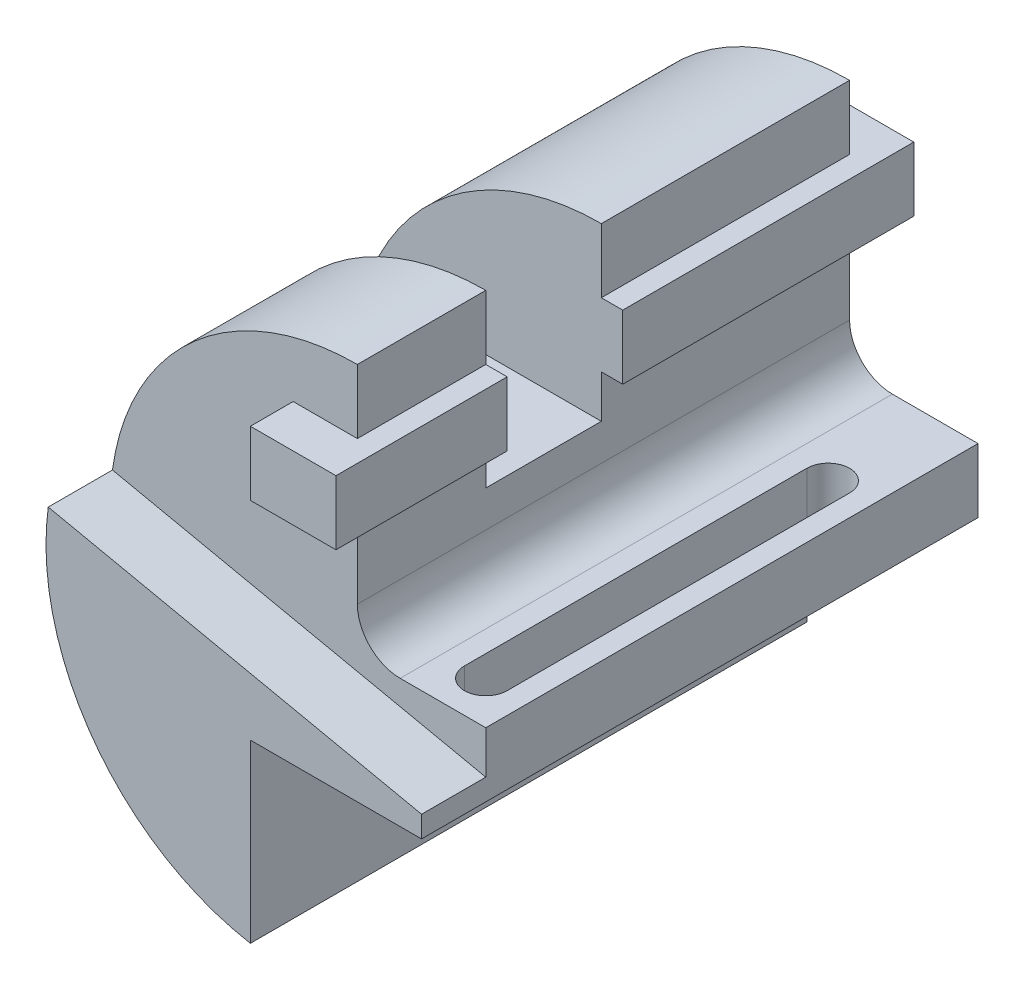
ISO-10303-21;
HEADER;
FILE_DESCRIPTION(('STEP AP214'),'2;1');
FILE_NAME('part.step','',(''),(''),'','','');
FILE_SCHEMA(('AUTOMOTIVE_DESIGN { 1 0 10303 214 1 1 1 1 }'));
ENDSEC;
DATA;
#1=APPLICATION_CONTEXT('core data for automotive mechanical design processes');
#2=APPLICATION_PROTOCOL_DEFINITION('international standard','automotive_design',2000,#1);
#3=PRODUCT_CONTEXT('',#1,'mechanical');
#4=PRODUCT('Part','Part','',(#3));
#5=PRODUCT_RELATED_PRODUCT_CATEGORY('part','',(#4));
#6=PRODUCT_DEFINITION_FORMATION('','',#4);
#7=PRODUCT_DEFINITION_CONTEXT('part definition',#1,'design');
#8=PRODUCT_DEFINITION('design','',#6,#7);
#9=PRODUCT_DEFINITION_SHAPE('','',#8);
#10=(LENGTH_UNIT() NAMED_UNIT(*) SI_UNIT(.MILLI.,.METRE.));
#11=(NAMED_UNIT(*) PLANE_ANGLE_UNIT() SI_UNIT($,.RADIAN.));
#12=(NAMED_UNIT(*) SI_UNIT($,.STERADIAN.) SOLID_ANGLE_UNIT());
#13=UNCERTAINTY_MEASURE_WITH_UNIT(LENGTH_MEASURE(1.E-05),#10,'distance_accuracy_value','');
#14=(GEOMETRIC_REPRESENTATION_CONTEXT(3) GLOBAL_UNCERTAINTY_ASSIGNED_CONTEXT((#13)) GLOBAL_UNIT_ASSIGNED_CONTEXT((#10,
#11,#12)) REPRESENTATION_CONTEXT('',''));
#15=CARTESIAN_POINT('',(0.,0.,0.));
#16=DIRECTION('',(0.,0.,1.));
#17=DIRECTION('',(1.,0.,0.));
#18=AXIS2_PLACEMENT_3D('',#15,#16,#17);
#19=CARTESIAN_POINT('',(10.,56.8776098302311,115.));
#20=DIRECTION('',(0.,0.,1.));
#21=DIRECTION('',(1.,0.,0.));
#22=AXIS2_PLACEMENT_3D('',#19,#20,#21);
#23=PLANE('',#22);
#24=CARTESIAN_POINT('',(10.,56.8776098302311,115.));
#25=DIRECTION('',(0.,0.,1.));
#26=DIRECTION('',(1.,0.,0.));
#27=AXIS2_PLACEMENT_3D('',#24,#25,#26);
#28=CIRCLE('',#27,57.75);
#29=CARTESIAN_POINT('',(10.,114.627609830231,115.));
#30=VERTEX_POINT('',#29);
#31=CARTESIAN_POINT('',(-47.222231127926,64.6672673799707,115.));
#32=VERTEX_POINT('',#31);
#33=EDGE_CURVE('E376',#30,#32,#28,.T.);
#34=ORIENTED_EDGE('',*,*,#33,.T.);
#35=DIRECTION('',(-0.978147600733806,0.207911690817756,0.));
#36=VECTOR('',#35,1.);
#37=CARTESIAN_POINT('',(40.,46.1276098302311,115.));
#38=LINE('',#37,#36);
#39=CARTESIAN_POINT('',(40.,46.1276098302311,115.));
#40=VERTEX_POINT('',#39);
#41=EDGE_CURVE('E264',#40,#32,#38,.T.);
#42=ORIENTED_EDGE('',*,*,#41,.F.);
#43=DIRECTION('',(0.,1.,0.));
#44=VECTOR('',#43,1.);
#45=CARTESIAN_POINT('',(40.,41.1276098302311,115.));
#46=LINE('',#45,#44);
#47=CARTESIAN_POINT('',(40.,56.1276098302311,115.));
#48=VERTEX_POINT('',#47);
#49=EDGE_CURVE('E378',#40,#48,#46,.T.);
#50=ORIENTED_EDGE('',*,*,#49,.T.);
#51=DIRECTION('',(-1.,0.,0.));
#52=VECTOR('',#51,1.);
#53=CARTESIAN_POINT('',(40.,56.1276098302311,115.));
#54=LINE('',#53,#52);
#55=CARTESIAN_POINT('',(20.,56.1276098302311,115.));
#56=VERTEX_POINT('',#55);
#57=EDGE_CURVE('E381',#48,#56,#54,.T.);
#58=ORIENTED_EDGE('',*,*,#57,.T.);
#59=CARTESIAN_POINT('',(20.,66.1276098302311,115.));
#60=DIRECTION('',(0.,0.,-1.));
#61=DIRECTION('',(-1.,0.,0.));
#62=AXIS2_PLACEMENT_3D('',#59,#60,#61);
#63=CIRCLE('',#62,10.);
#64=CARTESIAN_POINT('',(9.99999999999999,66.1276098302311,115.));
#65=VERTEX_POINT('',#64);
#66=EDGE_CURVE('E383',#56,#65,#63,.T.);
#67=ORIENTED_EDGE('',*,*,#66,.T.);
#68=DIRECTION('',(0.,1.,0.));
#69=VECTOR('',#68,1.);
#70=CARTESIAN_POINT('',(9.99999999999999,66.1276098302311,115.));
#71=LINE('',#70,#69);
#72=CARTESIAN_POINT('',(10.,84.6276098302311,115.));
#73=VERTEX_POINT('',#72);
#74=EDGE_CURVE('E386',#65,#73,#71,.T.);
#75=ORIENTED_EDGE('',*,*,#74,.T.);
#76=DIRECTION('',(1.,0.,0.));
#77=VECTOR('',#76,1.);
#78=CARTESIAN_POINT('',(10.,84.6276098302311,115.));
#79=LINE('',#78,#77);
#80=CARTESIAN_POINT('',(-5.00000000000003,84.6276098302311,115.));
#81=VERTEX_POINT('',#80);
#82=EDGE_CURVE('E366',#81,#73,#79,.T.);
#83=ORIENTED_EDGE('',*,*,#82,.F.);
#84=DIRECTION('',(0.,-1.,0.));
#85=VECTOR('',#84,1.);
#86=CARTESIAN_POINT('',(-5.00000000000003,56.8776098302311,115.));
#87=LINE('',#86,#85);
#88=CARTESIAN_POINT('',(-5.00000000000003,99.6276098302311,115.));
#89=VERTEX_POINT('',#88);
#90=EDGE_CURVE('E353',#89,#81,#87,.T.);
#91=ORIENTED_EDGE('',*,*,#90,.F.);
#92=DIRECTION('',(-1.,0.,0.));
#93=VECTOR('',#92,1.);
#94=CARTESIAN_POINT('',(10.,99.6276098302313,115.));
#95=LINE('',#94,#93);
#96=CARTESIAN_POINT('',(10.,99.6276098302313,115.));
#97=VERTEX_POINT('',#96);
#98=EDGE_CURVE('E373',#97,#89,#95,.T.);
#99=ORIENTED_EDGE('',*,*,#98,.F.);
#100=EDGE_CURVE('E385',#97,#30,#71,.T.);
#101=ORIENTED_EDGE('',*,*,#100,.T.);
#102=EDGE_LOOP('',(#34,#42,#50,#58,#67,#75,#83,#91,#99,#101));
#103=FACE_BOUND('',#102,.T.);
#104=ADVANCED_FACE('F43',(#103),#23,.T.);
#105=CARTESIAN_POINT('',(9.99999999999999,66.1276098302311,115.));
#106=DIRECTION('',(-1.,0.,0.));
#107=DIRECTION('',(0.,-1.,0.));
#108=AXIS2_PLACEMENT_3D('',#105,#106,#107);
#109=PLANE('',#108);
#110=DIRECTION('',(0.,0.,-1.));
#111=VECTOR('',#110,1.);
#112=CARTESIAN_POINT('',(10.,114.627609830231,115.));
#113=LINE('',#112,#111);
#114=CARTESIAN_POINT('',(10.,114.627609830231,58.));
#115=VERTEX_POINT('',#114);
#116=CARTESIAN_POINT('',(10.,114.627609830231,0.));
#117=VERTEX_POINT('',#116);
#118=EDGE_CURVE('E389',#115,#117,#113,.T.);
#119=ORIENTED_EDGE('',*,*,#118,.F.);
#120=DIRECTION('',(0.,-1.,0.));
#121=VECTOR('',#120,1.);
#122=CARTESIAN_POINT('',(9.99999999999999,66.1276098302311,58.));
#123=LINE('',#122,#121);
#124=CARTESIAN_POINT('',(10.,99.6276098302312,58.));
#125=VERTEX_POINT('',#124);
#126=EDGE_CURVE('E313',#115,#125,#123,.T.);
#127=ORIENTED_EDGE('',*,*,#126,.T.);
#128=DIRECTION('',(0.,0.,-1.));
#129=VECTOR('',#128,1.);
#130=CARTESIAN_POINT('',(10.,99.6276098302313,115.));
#131=LINE('',#130,#129);
#132=CARTESIAN_POINT('',(10.,99.6276098302311,0.));
#133=VERTEX_POINT('',#132);
#134=EDGE_CURVE('E369',#125,#133,#131,.T.);
#135=ORIENTED_EDGE('',*,*,#134,.T.);
#136=DIRECTION('',(0.,1.,0.));
#137=VECTOR('',#136,1.);
#138=CARTESIAN_POINT('',(9.99999999999999,66.1276098302311,0.));
#139=LINE('',#138,#137);
#140=EDGE_CURVE('E402',#133,#117,#139,.T.);
#141=ORIENTED_EDGE('',*,*,#140,.T.);
#142=EDGE_LOOP('',(#119,#127,#135,#141));
#143=FACE_BOUND('',#142,.T.);
#144=ADVANCED_FACE('F461',(#143),#109,.F.);
#145=CARTESIAN_POINT('',(-5.00000000000003,99.6276098302311,0.));
#146=DIRECTION('',(0.,1.,0.));
#147=DIRECTION('',(0.,0.,1.));
#148=AXIS2_PLACEMENT_3D('',#145,#146,#147);
#149=PLANE('',#148);
#150=DIRECTION('',(-1.,0.,0.));
#151=VECTOR('',#150,1.);
#152=CARTESIAN_POINT('',(-5.00000000000003,99.6276098302312,58.));
#153=LINE('',#152,#151);
#154=CARTESIAN_POINT('',(15.,99.6276098302311,58.));
#155=VERTEX_POINT('',#154);
#156=EDGE_CURVE('E308',#155,#125,#153,.T.);
#157=ORIENTED_EDGE('',*,*,#156,.F.);
#158=DIRECTION('',(0.,0.,1.));
#159=VECTOR('',#158,1.);
#160=CARTESIAN_POINT('',(15.,99.6276098302311,125.));
#161=LINE('',#160,#159);
#162=CARTESIAN_POINT('',(15.,99.6276098302311,-10.));
#163=VERTEX_POINT('',#162);
#164=EDGE_CURVE('E323',#163,#155,#161,.T.);
#165=ORIENTED_EDGE('',*,*,#164,.F.);
#166=DIRECTION('',(1.,0.,0.));
#167=VECTOR('',#166,1.);
#168=CARTESIAN_POINT('',(-5.00000000000003,99.6276098302311,-10.));
#169=LINE('',#168,#167);
#170=CARTESIAN_POINT('',(-5.00000000000003,99.6276098302311,-10.));
#171=VERTEX_POINT('',#170);
#172=EDGE_CURVE('E351',#171,#163,#169,.T.);
#173=ORIENTED_EDGE('',*,*,#172,.F.);
#174=DIRECTION('',(0.,0.,1.));
#175=VECTOR('',#174,1.);
#176=CARTESIAN_POINT('',(-5.00000000000003,99.6276098302311,125.));
#177=LINE('',#176,#175);
#178=CARTESIAN_POINT('',(-5.00000000000003,99.6276098302311,0.));
#179=VERTEX_POINT('',#178);
#180=EDGE_CURVE('E337',#171,#179,#177,.T.);
#181=ORIENTED_EDGE('',*,*,#180,.T.);
#182=DIRECTION('',(-1.,0.,0.));
#183=VECTOR('',#182,1.);
#184=CARTESIAN_POINT('',(10.,99.6276098302311,0.));
#185=LINE('',#184,#183);
#186=EDGE_CURVE('E432',#133,#179,#185,.T.);
#187=ORIENTED_EDGE('',*,*,#186,.F.);
#188=ORIENTED_EDGE('',*,*,#134,.F.);
#189=EDGE_LOOP('',(#157,#165,#173,#181,#187,#188));
#190=FACE_BOUND('',#189,.T.);
#191=ADVANCED_FACE('F455',(#190),#149,.T.);
#192=CARTESIAN_POINT('',(-5.00000000000003,84.6276098302311,-10.));
#193=DIRECTION('',(0.,-1.,0.));
#194=DIRECTION('',(0.,0.,-1.));
#195=AXIS2_PLACEMENT_3D('',#192,#193,#194);
#196=PLANE('',#195);
#197=DIRECTION('',(1.,0.,0.));
#198=VECTOR('',#197,1.);
#199=CARTESIAN_POINT('',(-5.00000000000003,84.6276098302311,58.));
#200=LINE('',#199,#198);
#201=CARTESIAN_POINT('',(10.,84.6276098302311,58.));
#202=VERTEX_POINT('',#201);
#203=CARTESIAN_POINT('',(15.,84.6276098302311,58.));
#204=VERTEX_POINT('',#203);
#205=EDGE_CURVE('E306',#202,#204,#200,.T.);
#206=ORIENTED_EDGE('',*,*,#205,.F.);
#207=DIRECTION('',(0.,0.,1.));
#208=VECTOR('',#207,1.);
#209=CARTESIAN_POINT('',(10.,84.6276098302311,115.));
#210=LINE('',#209,#208);
#211=CARTESIAN_POINT('',(10.,84.6276098302311,0.));
#212=VERTEX_POINT('',#211);
#213=EDGE_CURVE('E363',#212,#202,#210,.T.);
#214=ORIENTED_EDGE('',*,*,#213,.F.);
#215=DIRECTION('',(1.,0.,0.));
#216=VECTOR('',#215,1.);
#217=CARTESIAN_POINT('',(10.,84.6276098302311,0.));
#218=LINE('',#217,#216);
#219=CARTESIAN_POINT('',(-5.00000000000003,84.6276098302311,0.));
#220=VERTEX_POINT('',#219);
#221=EDGE_CURVE('E429',#220,#212,#218,.T.);
#222=ORIENTED_EDGE('',*,*,#221,.F.);
#223=DIRECTION('',(0.,0.,-1.));
#224=VECTOR('',#223,1.);
#225=CARTESIAN_POINT('',(-5.00000000000003,84.6276098302311,-10.));
#226=LINE('',#225,#224);
#227=CARTESIAN_POINT('',(-5.00000000000003,84.6276098302311,-10.));
#228=VERTEX_POINT('',#227);
#229=EDGE_CURVE('E343',#220,#228,#226,.T.);
#230=ORIENTED_EDGE('',*,*,#229,.T.);
#231=DIRECTION('',(1.,0.,0.));
#232=VECTOR('',#231,1.);
#233=CARTESIAN_POINT('',(-5.00000000000003,84.6276098302311,-10.));
#234=LINE('',#233,#232);
#235=CARTESIAN_POINT('',(15.,84.6276098302311,-10.));
#236=VERTEX_POINT('',#235);
#237=EDGE_CURVE('E354',#228,#236,#234,.T.);
#238=ORIENTED_EDGE('',*,*,#237,.T.);
#239=DIRECTION('',(0.,0.,-1.));
#240=VECTOR('',#239,1.);
#241=CARTESIAN_POINT('',(15.,84.6276098302311,-10.));
#242=LINE('',#241,#240);
#243=EDGE_CURVE('E329',#204,#236,#242,.T.);
#244=ORIENTED_EDGE('',*,*,#243,.F.);
#245=EDGE_LOOP('',(#206,#214,#222,#230,#238,#244));
#246=FACE_BOUND('',#245,.T.);
#247=ADVANCED_FACE('F446',(#246),#196,.T.);
#248=CARTESIAN_POINT('',(15.,0.,0.));
#249=DIRECTION('',(-1.,0.,0.));
#250=DIRECTION('',(0.,0.,1.));
#251=AXIS2_PLACEMENT_3D('',#248,#249,#250);
#252=PLANE('',#251);
#253=ORIENTED_EDGE('',*,*,#164,.T.);
#254=DIRECTION('',(0.,-1.,0.));
#255=VECTOR('',#254,1.);
#256=CARTESIAN_POINT('',(15.,0.,58.));
#257=LINE('',#256,#255);
#258=EDGE_CURVE('E51',#155,#204,#257,.T.);
#259=ORIENTED_EDGE('',*,*,#258,.T.);
#260=ORIENTED_EDGE('',*,*,#243,.T.);
#261=DIRECTION('',(0.,1.,0.));
#262=VECTOR('',#261,1.);
#263=CARTESIAN_POINT('',(15.,99.6276098302311,-10.));
#264=LINE('',#263,#262);
#265=EDGE_CURVE('E333',#236,#163,#264,.T.);
#266=ORIENTED_EDGE('',*,*,#265,.T.);
#267=EDGE_LOOP('',(#253,#259,#260,#266));
#268=FACE_BOUND('',#267,.T.);
#269=ADVANCED_FACE('F440',(#268),#252,.F.);
#270=CARTESIAN_POINT('',(10.,99.6276098302312,85.));
#271=VERTEX_POINT('',#270);
#272=EDGE_CURVE('E370',#97,#271,#131,.T.);
#273=ORIENTED_EDGE('',*,*,#272,.T.);
#274=DIRECTION('',(0.,1.,0.));
#275=VECTOR('',#274,1.);
#276=CARTESIAN_POINT('',(9.99999999999999,66.1276098302311,85.));
#277=LINE('',#276,#275);
#278=CARTESIAN_POINT('',(10.,114.627609830231,85.));
#279=VERTEX_POINT('',#278);
#280=EDGE_CURVE('E300',#271,#279,#277,.T.);
#281=ORIENTED_EDGE('',*,*,#280,.T.);
#282=EDGE_CURVE('E405',#30,#279,#113,.T.);
#283=ORIENTED_EDGE('',*,*,#282,.F.);
#284=ORIENTED_EDGE('',*,*,#100,.F.);
#285=EDGE_LOOP('',(#273,#281,#283,#284));
#286=FACE_BOUND('',#285,.T.);
#287=ADVANCED_FACE('F501',(#286),#109,.F.);
#288=CARTESIAN_POINT('',(10.,56.8776098302311,115.));
#289=DIRECTION('',(0.,0.,-1.));
#290=DIRECTION('',(-1.,0.,0.));
#291=AXIS2_PLACEMENT_3D('',#288,#289,#290);
#292=CYLINDRICAL_SURFACE('',#291,57.75);
#293=DIRECTION('',(0.,0.,-1.));
#294=VECTOR('',#293,1.);
#295=CARTESIAN_POINT('',(-44.9545266561363,74.6276098302311,115.));
#296=LINE('',#295,#294);
#297=CARTESIAN_POINT('',(-44.9545266561363,74.6276098302311,85.));
#298=VERTEX_POINT('',#297);
#299=CARTESIAN_POINT('',(-44.9545266561363,74.6276098302311,58.));
#300=VERTEX_POINT('',#299);
#301=EDGE_CURVE('E319',#298,#300,#296,.T.);
#302=ORIENTED_EDGE('',*,*,#301,.T.);
#303=CARTESIAN_POINT('',(10.,56.8776098302311,58.));
#304=DIRECTION('',(0.,0.,-1.));
#305=DIRECTION('',(-1.,0.,0.));
#306=AXIS2_PLACEMENT_3D('',#303,#304,#305);
#307=CIRCLE('',#306,57.75);
#308=EDGE_CURVE('E316',#300,#115,#307,.T.);
#309=ORIENTED_EDGE('',*,*,#308,.T.);
#310=ORIENTED_EDGE('',*,*,#118,.T.);
#311=CARTESIAN_POINT('',(10.,56.8776098302311,0.));
#312=DIRECTION('',(0.,0.,1.));
#313=DIRECTION('',(1.,0.,0.));
#314=AXIS2_PLACEMENT_3D('',#311,#312,#313);
#315=CIRCLE('',#314,57.75);
#316=CARTESIAN_POINT('',(0.,0.,0.));
#317=VERTEX_POINT('',#316);
#318=EDGE_CURVE('E375',#117,#317,#315,.T.);
#319=ORIENTED_EDGE('',*,*,#318,.T.);
#320=DIRECTION('',(0.,0.,-1.));
#321=VECTOR('',#320,1.);
#322=CARTESIAN_POINT('',(0.,0.,115.));
#323=LINE('',#322,#321);
#324=CARTESIAN_POINT('',(0.,0.,130.));
#325=VERTEX_POINT('',#324);
#326=EDGE_CURVE('E423',#325,#317,#323,.T.);
#327=ORIENTED_EDGE('',*,*,#326,.F.);
#328=CARTESIAN_POINT('',(10.,56.8776098302311,130.));
#329=DIRECTION('',(0.,0.,1.));
#330=DIRECTION('',(1.,0.,0.));
#331=AXIS2_PLACEMENT_3D('',#328,#329,#330);
#332=CIRCLE('',#331,57.75);
#333=CARTESIAN_POINT('',(-47.222231127926,64.6672673799707,130.));
#334=VERTEX_POINT('',#333);
#335=EDGE_CURVE('E270',#334,#325,#332,.T.);
#336=ORIENTED_EDGE('',*,*,#335,.F.);
#337=DIRECTION('',(0.,0.,-1.));
#338=VECTOR('',#337,1.);
#339=CARTESIAN_POINT('',(-47.222231127926,64.6672673799707,130.));
#340=LINE('',#339,#338);
#341=EDGE_CURVE('E279',#334,#32,#340,.T.);
#342=ORIENTED_EDGE('',*,*,#341,.T.);
#343=ORIENTED_EDGE('',*,*,#33,.F.);
#344=ORIENTED_EDGE('',*,*,#282,.T.);
#345=CARTESIAN_POINT('',(10.,56.8776098302311,85.));
#346=DIRECTION('',(0.,0.,1.));
#347=DIRECTION('',(0.,-1.,0.));
#348=AXIS2_PLACEMENT_3D('',#345,#346,#347);
#349=CIRCLE('',#348,57.75);
#350=EDGE_CURVE('E303',#279,#298,#349,.T.);
#351=ORIENTED_EDGE('',*,*,#350,.T.);
#352=EDGE_LOOP('',(#302,#309,#310,#319,#327,#336,#342,#343,#344,#351));
#353=FACE_BOUND('',#352,.T.);
#354=ADVANCED_FACE('F45',(#353),#292,.T.);
#355=CARTESIAN_POINT('',(0.,0.,115.));
#356=DIRECTION('',(-1.,0.,0.));
#357=DIRECTION('',(0.,0.,1.));
#358=AXIS2_PLACEMENT_3D('',#355,#356,#357);
#359=PLANE('',#358);
#360=DIRECTION('',(0.,1.,0.));
#361=VECTOR('',#360,1.);
#362=CARTESIAN_POINT('',(0.,0.,0.));
#363=LINE('',#362,#361);
#364=CARTESIAN_POINT('',(0.,41.1276098302311,0.));
#365=VERTEX_POINT('',#364);
#366=EDGE_CURVE('E392',#317,#365,#363,.T.);
#367=ORIENTED_EDGE('',*,*,#366,.T.);
#368=DIRECTION('',(0.,0.,-1.));
#369=VECTOR('',#368,1.);
#370=CARTESIAN_POINT('',(0.,41.1276098302311,115.));
#371=LINE('',#370,#369);
#372=CARTESIAN_POINT('',(0.,41.1276098302311,130.));
#373=VERTEX_POINT('',#372);
#374=EDGE_CURVE('E420',#373,#365,#371,.T.);
#375=ORIENTED_EDGE('',*,*,#374,.F.);
#376=DIRECTION('',(0.,1.,0.));
#377=VECTOR('',#376,1.);
#378=CARTESIAN_POINT('',(0.,0.,130.));
#379=LINE('',#378,#377);
#380=EDGE_CURVE('E273',#325,#373,#379,.T.);
#381=ORIENTED_EDGE('',*,*,#380,.F.);
#382=ORIENTED_EDGE('',*,*,#326,.T.);
#383=EDGE_LOOP('',(#367,#375,#381,#382));
#384=FACE_BOUND('',#383,.T.);
#385=ADVANCED_FACE('F483',(#384),#359,.F.);
#386=CARTESIAN_POINT('',(0.,41.1276098302311,115.));
#387=DIRECTION('',(0.,1.,0.));
#388=DIRECTION('',(0.,0.,1.));
#389=AXIS2_PLACEMENT_3D('',#386,#387,#388);
#390=PLANE('',#389);
#391=DIRECTION('',(0.,0.,-1.));
#392=VECTOR('',#391,1.);
#393=CARTESIAN_POINT('',(25.,41.1276098302311,115.));
#394=LINE('',#393,#392);
#395=CARTESIAN_POINT('',(25.,41.1276098302311,105.));
#396=VERTEX_POINT('',#395);
#397=CARTESIAN_POINT('',(25.,41.1276098302311,25.));
#398=VERTEX_POINT('',#397);
#399=EDGE_CURVE('E259',#396,#398,#394,.T.);
#400=ORIENTED_EDGE('',*,*,#399,.F.);
#401=CARTESIAN_POINT('',(30.,41.1276098302311,105.));
#402=DIRECTION('',(0.,1.,0.));
#403=DIRECTION('',(0.,0.,1.));
#404=AXIS2_PLACEMENT_3D('',#401,#402,#403);
#405=CIRCLE('',#404,5.);
#406=CARTESIAN_POINT('',(35.,41.1276098302311,105.));
#407=VERTEX_POINT('',#406);
#408=EDGE_CURVE('E261',#396,#407,#405,.T.);
#409=ORIENTED_EDGE('',*,*,#408,.T.);
#410=DIRECTION('',(0.,0.,-1.));
#411=VECTOR('',#410,1.);
#412=CARTESIAN_POINT('',(35.,41.1276098302311,115.));
#413=LINE('',#412,#411);
#414=CARTESIAN_POINT('',(35.,41.1276098302311,25.));
#415=VERTEX_POINT('',#414);
#416=EDGE_CURVE('E254',#407,#415,#413,.T.);
#417=ORIENTED_EDGE('',*,*,#416,.T.);
#418=CARTESIAN_POINT('',(30.,41.1276098302311,25.));
#419=DIRECTION('',(0.,1.,0.));
#420=DIRECTION('',(0.,0.,1.));
#421=AXIS2_PLACEMENT_3D('',#418,#419,#420);
#422=CIRCLE('',#421,5.);
#423=EDGE_CURVE('E234',#415,#398,#422,.T.);
#424=ORIENTED_EDGE('',*,*,#423,.T.);
#425=EDGE_LOOP('',(#400,#409,#417,#424));
#426=FACE_BOUND('',#425,.T.);
#427=DIRECTION('',(1.,0.,0.));
#428=VECTOR('',#427,1.);
#429=CARTESIAN_POINT('',(0.,41.1276098302311,0.));
#430=LINE('',#429,#428);
#431=CARTESIAN_POINT('',(40.,41.1276098302311,0.));
#432=VERTEX_POINT('',#431);
#433=EDGE_CURVE('E394',#365,#432,#430,.T.);
#434=ORIENTED_EDGE('',*,*,#433,.T.);
#435=DIRECTION('',(0.,0.,-1.));
#436=VECTOR('',#435,1.);
#437=CARTESIAN_POINT('',(40.,41.1276098302311,115.));
#438=LINE('',#437,#436);
#439=CARTESIAN_POINT('',(40.,41.1276098302311,130.));
#440=VERTEX_POINT('',#439);
#441=EDGE_CURVE('E417',#440,#432,#438,.T.);
#442=ORIENTED_EDGE('',*,*,#441,.F.);
#443=DIRECTION('',(1.,0.,0.));
#444=VECTOR('',#443,1.);
#445=CARTESIAN_POINT('',(0.,41.1276098302311,130.));
#446=LINE('',#445,#444);
#447=EDGE_CURVE('E276',#373,#440,#446,.T.);
#448=ORIENTED_EDGE('',*,*,#447,.F.);
#449=ORIENTED_EDGE('',*,*,#374,.T.);
#450=EDGE_LOOP('',(#434,#442,#448,#449));
#451=FACE_BOUND('',#450,.T.);
#452=ADVANCED_FACE('F529',(#426,#451),#390,.F.);
#453=CARTESIAN_POINT('',(40.,41.1276098302311,115.));
#454=DIRECTION('',(-1.,0.,0.));
#455=DIRECTION('',(0.,-1.,0.));
#456=AXIS2_PLACEMENT_3D('',#453,#454,#455);
#457=PLANE('',#456);
#458=DIRECTION('',(0.,1.,0.));
#459=VECTOR('',#458,1.);
#460=CARTESIAN_POINT('',(40.,41.1276098302311,0.));
#461=LINE('',#460,#459);
#462=CARTESIAN_POINT('',(40.,56.1276098302311,0.));
#463=VERTEX_POINT('',#462);
#464=EDGE_CURVE('E396',#432,#463,#461,.T.);
#465=ORIENTED_EDGE('',*,*,#464,.T.);
#466=DIRECTION('',(0.,0.,-1.));
#467=VECTOR('',#466,1.);
#468=CARTESIAN_POINT('',(40.,56.1276098302311,115.));
#469=LINE('',#468,#467);
#470=EDGE_CURVE('E414',#48,#463,#469,.T.);
#471=ORIENTED_EDGE('',*,*,#470,.F.);
#472=ORIENTED_EDGE('',*,*,#49,.F.);
#473=DIRECTION('',(0.,0.,-1.));
#474=VECTOR('',#473,1.);
#475=CARTESIAN_POINT('',(40.,46.1276098302311,130.));
#476=LINE('',#475,#474);
#477=CARTESIAN_POINT('',(40.,46.1276098302311,130.));
#478=VERTEX_POINT('',#477);
#479=EDGE_CURVE('E284',#478,#40,#476,.T.);
#480=ORIENTED_EDGE('',*,*,#479,.F.);
#481=DIRECTION('',(0.,1.,0.));
#482=VECTOR('',#481,1.);
#483=CARTESIAN_POINT('',(40.,41.1276098302311,130.));
#484=LINE('',#483,#482);
#485=EDGE_CURVE('E265',#440,#478,#484,.T.);
#486=ORIENTED_EDGE('',*,*,#485,.F.);
#487=ORIENTED_EDGE('',*,*,#441,.T.);
#488=EDGE_LOOP('',(#465,#471,#472,#480,#486,#487));
#489=FACE_BOUND('',#488,.T.);
#490=ADVANCED_FACE('F527',(#489),#457,.F.);
#491=CARTESIAN_POINT('',(40.,56.1276098302311,115.));
#492=DIRECTION('',(0.,-1.,0.));
#493=DIRECTION('',(1.,0.,0.));
#494=AXIS2_PLACEMENT_3D('',#491,#492,#493);
#495=PLANE('',#494);
#496=DIRECTION('',(0.,0.,-1.));
#497=VECTOR('',#496,1.);
#498=CARTESIAN_POINT('',(35.,56.1276098302311,105.));
#499=LINE('',#498,#497);
#500=CARTESIAN_POINT('',(35.,56.1276098302311,105.));
#501=VERTEX_POINT('',#500);
#502=CARTESIAN_POINT('',(35.,56.1276098302311,25.));
#503=VERTEX_POINT('',#502);
#504=EDGE_CURVE('E240',#501,#503,#499,.T.);
#505=ORIENTED_EDGE('',*,*,#504,.F.);
#506=CARTESIAN_POINT('',(30.,56.1276098302311,105.));
#507=DIRECTION('',(0.,1.,0.));
#508=DIRECTION('',(0.,0.,1.));
#509=AXIS2_PLACEMENT_3D('',#506,#507,#508);
#510=CIRCLE('',#509,5.);
#511=CARTESIAN_POINT('',(25.,56.1276098302311,105.));
#512=VERTEX_POINT('',#511);
#513=EDGE_CURVE('E66',#512,#501,#510,.T.);
#514=ORIENTED_EDGE('',*,*,#513,.F.);
#515=DIRECTION('',(0.,0.,-1.));
#516=VECTOR('',#515,1.);
#517=CARTESIAN_POINT('',(25.,56.1276098302311,105.));
#518=LINE('',#517,#516);
#519=CARTESIAN_POINT('',(25.,56.1276098302311,25.));
#520=VERTEX_POINT('',#519);
#521=EDGE_CURVE('E247',#512,#520,#518,.T.);
#522=ORIENTED_EDGE('',*,*,#521,.T.);
#523=CARTESIAN_POINT('',(30.,56.1276098302311,25.));
#524=DIRECTION('',(0.,1.,0.));
#525=DIRECTION('',(0.,0.,1.));
#526=AXIS2_PLACEMENT_3D('',#523,#524,#525);
#527=CIRCLE('',#526,5.);
#528=EDGE_CURVE('E231',#503,#520,#527,.T.);
#529=ORIENTED_EDGE('',*,*,#528,.F.);
#530=EDGE_LOOP('',(#505,#514,#522,#529));
#531=FACE_BOUND('',#530,.T.);
#532=DIRECTION('',(-1.,0.,0.));
#533=VECTOR('',#532,1.);
#534=CARTESIAN_POINT('',(40.,56.1276098302311,0.));
#535=LINE('',#534,#533);
#536=CARTESIAN_POINT('',(20.,56.1276098302311,0.));
#537=VERTEX_POINT('',#536);
#538=EDGE_CURVE('E398',#463,#537,#535,.T.);
#539=ORIENTED_EDGE('',*,*,#538,.T.);
#540=DIRECTION('',(0.,0.,-1.));
#541=VECTOR('',#540,1.);
#542=CARTESIAN_POINT('',(20.,56.1276098302311,115.));
#543=LINE('',#542,#541);
#544=EDGE_CURVE('E411',#56,#537,#543,.T.);
#545=ORIENTED_EDGE('',*,*,#544,.F.);
#546=ORIENTED_EDGE('',*,*,#57,.F.);
#547=ORIENTED_EDGE('',*,*,#470,.T.);
#548=EDGE_LOOP('',(#539,#545,#546,#547));
#549=FACE_BOUND('',#548,.T.);
#550=ADVANCED_FACE('F244',(#531,#549),#495,.F.);
#551=CARTESIAN_POINT('',(20.,66.1276098302311,115.));
#552=DIRECTION('',(0.,0.,-1.));
#553=DIRECTION('',(-1.,0.,0.));
#554=AXIS2_PLACEMENT_3D('',#551,#552,#553);
#555=CYLINDRICAL_SURFACE('',#554,10.);
#556=CARTESIAN_POINT('',(20.,66.1276098302311,0.));
#557=DIRECTION('',(0.,0.,-1.));
#558=DIRECTION('',(-1.,0.,0.));
#559=AXIS2_PLACEMENT_3D('',#556,#557,#558);
#560=CIRCLE('',#559,10.);
#561=CARTESIAN_POINT('',(9.99999999999999,66.1276098302311,0.));
#562=VERTEX_POINT('',#561);
#563=EDGE_CURVE('E400',#537,#562,#560,.T.);
#564=ORIENTED_EDGE('',*,*,#563,.T.);
#565=DIRECTION('',(0.,0.,-1.));
#566=VECTOR('',#565,1.);
#567=CARTESIAN_POINT('',(9.99999999999999,66.1276098302311,115.));
#568=LINE('',#567,#566);
#569=EDGE_CURVE('E408',#65,#562,#568,.T.);
#570=ORIENTED_EDGE('',*,*,#569,.F.);
#571=ORIENTED_EDGE('',*,*,#66,.F.);
#572=ORIENTED_EDGE('',*,*,#544,.T.);
#573=EDGE_LOOP('',(#564,#570,#571,#572));
#574=FACE_BOUND('',#573,.T.);
#575=ADVANCED_FACE('F523',(#574),#555,.F.);
#576=ORIENTED_EDGE('',*,*,#213,.T.);
#577=DIRECTION('',(0.,-1.,0.));
#578=VECTOR('',#577,1.);
#579=CARTESIAN_POINT('',(9.99999999999999,66.1276098302311,58.));
#580=LINE('',#579,#578);
#581=CARTESIAN_POINT('',(9.99999999999999,74.6276098302311,58.));
#582=VERTEX_POINT('',#581);
#583=EDGE_CURVE('E310',#202,#582,#580,.T.);
#584=ORIENTED_EDGE('',*,*,#583,.T.);
#585=DIRECTION('',(0.,0.,1.));
#586=VECTOR('',#585,1.);
#587=CARTESIAN_POINT('',(9.99999999999999,74.6276098302311,115.));
#588=LINE('',#587,#586);
#589=CARTESIAN_POINT('',(9.99999999999999,74.6276098302311,85.));
#590=VERTEX_POINT('',#589);
#591=EDGE_CURVE('E11',#582,#590,#588,.T.);
#592=ORIENTED_EDGE('',*,*,#591,.T.);
#593=DIRECTION('',(0.,1.,0.));
#594=VECTOR('',#593,1.);
#595=CARTESIAN_POINT('',(9.99999999999999,66.1276098302311,85.));
#596=LINE('',#595,#594);
#597=CARTESIAN_POINT('',(10.,84.6276098302311,85.));
#598=VERTEX_POINT('',#597);
#599=EDGE_CURVE('E297',#590,#598,#596,.T.);
#600=ORIENTED_EDGE('',*,*,#599,.T.);
#601=EDGE_CURVE('E362',#598,#73,#210,.T.);
#602=ORIENTED_EDGE('',*,*,#601,.T.);
#603=ORIENTED_EDGE('',*,*,#74,.F.);
#604=ORIENTED_EDGE('',*,*,#569,.T.);
#605=EDGE_CURVE('E379',#562,#212,#139,.T.);
#606=ORIENTED_EDGE('',*,*,#605,.T.);
#607=EDGE_LOOP('',(#576,#584,#592,#600,#602,#603,#604,#606));
#608=FACE_BOUND('',#607,.T.);
#609=ADVANCED_FACE('F471',(#608),#109,.F.);
#610=CARTESIAN_POINT('',(10.,56.8776098302311,0.));
#611=DIRECTION('',(0.,0.,1.));
#612=DIRECTION('',(1.,0.,0.));
#613=AXIS2_PLACEMENT_3D('',#610,#611,#612);
#614=PLANE('',#613);
#615=ORIENTED_EDGE('',*,*,#140,.F.);
#616=ORIENTED_EDGE('',*,*,#186,.T.);
#617=DIRECTION('',(0.,-1.,0.));
#618=VECTOR('',#617,1.);
#619=CARTESIAN_POINT('',(-5.00000000000003,56.8776098302311,0.));
#620=LINE('',#619,#618);
#621=EDGE_CURVE('E426',#179,#220,#620,.T.);
#622=ORIENTED_EDGE('',*,*,#621,.T.);
#623=ORIENTED_EDGE('',*,*,#221,.T.);
#624=ORIENTED_EDGE('',*,*,#605,.F.);
#625=ORIENTED_EDGE('',*,*,#563,.F.);
#626=ORIENTED_EDGE('',*,*,#538,.F.);
#627=ORIENTED_EDGE('',*,*,#464,.F.);
#628=ORIENTED_EDGE('',*,*,#433,.F.);
#629=ORIENTED_EDGE('',*,*,#366,.F.);
#630=ORIENTED_EDGE('',*,*,#318,.F.);
#631=EDGE_LOOP('',(#615,#616,#622,#623,#624,#625,#626,#627,#628,#629,#630));
#632=FACE_BOUND('',#631,.T.);
#633=ADVANCED_FACE('F475',(#632),#614,.F.);
#634=CARTESIAN_POINT('',(-5.00000000000003,0.,0.));
#635=DIRECTION('',(-1.,0.,0.));
#636=DIRECTION('',(0.,0.,1.));
#637=AXIS2_PLACEMENT_3D('',#634,#635,#636);
#638=PLANE('',#637);
#639=ORIENTED_EDGE('',*,*,#621,.F.);
#640=ORIENTED_EDGE('',*,*,#180,.F.);
#641=DIRECTION('',(0.,1.,0.));
#642=VECTOR('',#641,1.);
#643=CARTESIAN_POINT('',(-5.00000000000003,99.6276098302311,-10.));
#644=LINE('',#643,#642);
#645=EDGE_CURVE('E347',#228,#171,#644,.T.);
#646=ORIENTED_EDGE('',*,*,#645,.F.);
#647=ORIENTED_EDGE('',*,*,#229,.F.);
#648=EDGE_LOOP('',(#639,#640,#646,#647));
#649=FACE_BOUND('',#648,.T.);
#650=ADVANCED_FACE('F478',(#649),#638,.T.);
#651=DIRECTION('',(1.,0.,0.));
#652=VECTOR('',#651,1.);
#653=CARTESIAN_POINT('',(-5.00000000000003,99.6276098302312,85.));
#654=LINE('',#653,#652);
#655=CARTESIAN_POINT('',(15.,99.6276098302311,85.));
#656=VERTEX_POINT('',#655);
#657=EDGE_CURVE('E295',#271,#656,#654,.T.);
#658=ORIENTED_EDGE('',*,*,#657,.F.);
#659=ORIENTED_EDGE('',*,*,#272,.F.);
#660=ORIENTED_EDGE('',*,*,#98,.T.);
#661=CARTESIAN_POINT('',(-5.00000000000003,99.6276098302311,125.));
#662=VERTEX_POINT('',#661);
#663=EDGE_CURVE('E336',#89,#662,#177,.T.);
#664=ORIENTED_EDGE('',*,*,#663,.T.);
#665=DIRECTION('',(1.,0.,0.));
#666=VECTOR('',#665,1.);
#667=CARTESIAN_POINT('',(-5.00000000000003,99.6276098302311,125.));
#668=LINE('',#667,#666);
#669=CARTESIAN_POINT('',(15.,99.6276098302311,125.));
#670=VERTEX_POINT('',#669);
#671=EDGE_CURVE('E350',#662,#670,#668,.T.);
#672=ORIENTED_EDGE('',*,*,#671,.T.);
#673=EDGE_CURVE('E322',#656,#670,#161,.T.);
#674=ORIENTED_EDGE('',*,*,#673,.F.);
#675=EDGE_LOOP('',(#658,#659,#660,#664,#672,#674));
#676=FACE_BOUND('',#675,.T.);
#677=ADVANCED_FACE('F507',(#676),#149,.T.);
#678=CARTESIAN_POINT('',(-5.00000000000003,99.6276098302311,-10.));
#679=DIRECTION('',(0.,0.,-1.));
#680=DIRECTION('',(0.,1.,0.));
#681=AXIS2_PLACEMENT_3D('',#678,#679,#680);
#682=PLANE('',#681);
#683=ORIENTED_EDGE('',*,*,#172,.T.);
#684=ORIENTED_EDGE('',*,*,#265,.F.);
#685=ORIENTED_EDGE('',*,*,#237,.F.);
#686=ORIENTED_EDGE('',*,*,#645,.T.);
#687=EDGE_LOOP('',(#683,#684,#685,#686));
#688=FACE_BOUND('',#687,.T.);
#689=ADVANCED_FACE('F452',(#688),#682,.T.);
#690=DIRECTION('',(-1.,0.,0.));
#691=VECTOR('',#690,1.);
#692=CARTESIAN_POINT('',(-5.00000000000003,84.6276098302311,85.));
#693=LINE('',#692,#691);
#694=CARTESIAN_POINT('',(15.,84.6276098302311,85.));
#695=VERTEX_POINT('',#694);
#696=EDGE_CURVE('E291',#695,#598,#693,.T.);
#697=ORIENTED_EDGE('',*,*,#696,.F.);
#698=CARTESIAN_POINT('',(15.,84.6276098302311,125.));
#699=VERTEX_POINT('',#698);
#700=EDGE_CURVE('E330',#699,#695,#242,.T.);
#701=ORIENTED_EDGE('',*,*,#700,.F.);
#702=DIRECTION('',(1.,0.,0.));
#703=VECTOR('',#702,1.);
#704=CARTESIAN_POINT('',(-5.00000000000003,84.6276098302311,125.));
#705=LINE('',#704,#703);
#706=CARTESIAN_POINT('',(-5.00000000000003,84.6276098302311,125.));
#707=VERTEX_POINT('',#706);
#708=EDGE_CURVE('E357',#707,#699,#705,.T.);
#709=ORIENTED_EDGE('',*,*,#708,.F.);
#710=EDGE_CURVE('E344',#707,#81,#226,.T.);
#711=ORIENTED_EDGE('',*,*,#710,.T.);
#712=ORIENTED_EDGE('',*,*,#82,.T.);
#713=ORIENTED_EDGE('',*,*,#601,.F.);
#714=EDGE_LOOP('',(#697,#701,#709,#711,#712,#713));
#715=FACE_BOUND('',#714,.T.);
#716=ADVANCED_FACE('F515',(#715),#196,.T.);
#717=CARTESIAN_POINT('',(-5.00000000000003,84.6276098302311,125.));
#718=DIRECTION('',(0.,0.,1.));
#719=DIRECTION('',(0.,-1.,0.));
#720=AXIS2_PLACEMENT_3D('',#717,#718,#719);
#721=PLANE('',#720);
#722=ORIENTED_EDGE('',*,*,#708,.T.);
#723=DIRECTION('',(0.,-1.,0.));
#724=VECTOR('',#723,1.);
#725=CARTESIAN_POINT('',(15.,84.6276098302311,125.));
#726=LINE('',#725,#724);
#727=EDGE_CURVE('E326',#670,#699,#726,.T.);
#728=ORIENTED_EDGE('',*,*,#727,.F.);
#729=ORIENTED_EDGE('',*,*,#671,.F.);
#730=DIRECTION('',(0.,-1.,0.));
#731=VECTOR('',#730,1.);
#732=CARTESIAN_POINT('',(-5.00000000000003,84.6276098302311,125.));
#733=LINE('',#732,#731);
#734=EDGE_CURVE('E340',#662,#707,#733,.T.);
#735=ORIENTED_EDGE('',*,*,#734,.T.);
#736=EDGE_LOOP('',(#722,#728,#729,#735));
#737=FACE_BOUND('',#736,.T.);
#738=ADVANCED_FACE('F551',(#737),#721,.T.);
#739=ORIENTED_EDGE('',*,*,#663,.F.);
#740=ORIENTED_EDGE('',*,*,#90,.T.);
#741=ORIENTED_EDGE('',*,*,#710,.F.);
#742=ORIENTED_EDGE('',*,*,#734,.F.);
#743=EDGE_LOOP('',(#739,#740,#741,#742));
#744=FACE_BOUND('',#743,.T.);
#745=ADVANCED_FACE('F674',(#744),#638,.T.);
#746=ORIENTED_EDGE('',*,*,#700,.T.);
#747=DIRECTION('',(0.,1.,0.));
#748=VECTOR('',#747,1.);
#749=CARTESIAN_POINT('',(15.,0.,85.));
#750=LINE('',#749,#748);
#751=EDGE_CURVE('E435',#695,#656,#750,.T.);
#752=ORIENTED_EDGE('',*,*,#751,.T.);
#753=ORIENTED_EDGE('',*,*,#673,.T.);
#754=ORIENTED_EDGE('',*,*,#727,.T.);
#755=EDGE_LOOP('',(#746,#752,#753,#754));
#756=FACE_BOUND('',#755,.T.);
#757=ADVANCED_FACE('F511',(#756),#252,.F.);
#758=CARTESIAN_POINT('',(-47.75,74.6276098302311,85.));
#759=DIRECTION('',(0.,-1.,0.));
#760=DIRECTION('',(0.,0.,-1.));
#761=AXIS2_PLACEMENT_3D('',#758,#759,#760);
#762=PLANE('',#761);
#763=DIRECTION('',(1.,0.,0.));
#764=VECTOR('',#763,1.);
#765=CARTESIAN_POINT('',(-47.75,74.6276098302311,85.));
#766=LINE('',#765,#764);
#767=EDGE_CURVE('E287',#298,#590,#766,.T.);
#768=ORIENTED_EDGE('',*,*,#767,.T.);
#769=ORIENTED_EDGE('',*,*,#591,.F.);
#770=DIRECTION('',(1.,0.,0.));
#771=VECTOR('',#770,1.);
#772=CARTESIAN_POINT('',(-47.75,74.6276098302311,58.));
#773=LINE('',#772,#771);
#774=EDGE_CURVE('E288',#300,#582,#773,.T.);
#775=ORIENTED_EDGE('',*,*,#774,.F.);
#776=ORIENTED_EDGE('',*,*,#301,.F.);
#777=EDGE_LOOP('',(#768,#769,#775,#776));
#778=FACE_BOUND('',#777,.T.);
#779=ADVANCED_FACE('F468',(#778),#762,.F.);
#780=CARTESIAN_POINT('',(-47.75,74.6276098302311,58.));
#781=DIRECTION('',(0.,0.,-1.));
#782=DIRECTION('',(-1.,0.,0.));
#783=AXIS2_PLACEMENT_3D('',#780,#781,#782);
#784=PLANE('',#783);
#785=ORIENTED_EDGE('',*,*,#774,.T.);
#786=ORIENTED_EDGE('',*,*,#583,.F.);
#787=ORIENTED_EDGE('',*,*,#205,.T.);
#788=ORIENTED_EDGE('',*,*,#258,.F.);
#789=ORIENTED_EDGE('',*,*,#156,.T.);
#790=ORIENTED_EDGE('',*,*,#126,.F.);
#791=ORIENTED_EDGE('',*,*,#308,.F.);
#792=EDGE_LOOP('',(#785,#786,#787,#788,#789,#790,#791));
#793=FACE_BOUND('',#792,.T.);
#794=ADVANCED_FACE('F458',(#793),#784,.F.);
#795=CARTESIAN_POINT('',(-47.75,114.627609830231,85.));
#796=DIRECTION('',(0.,0.,1.));
#797=DIRECTION('',(0.,-1.,0.));
#798=AXIS2_PLACEMENT_3D('',#795,#796,#797);
#799=PLANE('',#798);
#800=ORIENTED_EDGE('',*,*,#280,.F.);
#801=ORIENTED_EDGE('',*,*,#657,.T.);
#802=ORIENTED_EDGE('',*,*,#751,.F.);
#803=ORIENTED_EDGE('',*,*,#696,.T.);
#804=ORIENTED_EDGE('',*,*,#599,.F.);
#805=ORIENTED_EDGE('',*,*,#767,.F.);
#806=ORIENTED_EDGE('',*,*,#350,.F.);
#807=EDGE_LOOP('',(#800,#801,#802,#803,#804,#805,#806));
#808=FACE_BOUND('',#807,.T.);
#809=ADVANCED_FACE('F504',(#808),#799,.F.);
#810=CARTESIAN_POINT('',(40.,46.1276098302311,130.));
#811=DIRECTION('',(-0.207911690817756,-0.978147600733806,0.));
#812=DIRECTION('',(0.978147600733807,-0.207911690817756,0.));
#813=AXIS2_PLACEMENT_3D('',#810,#811,#812);
#814=PLANE('',#813);
#815=ORIENTED_EDGE('',*,*,#41,.T.);
#816=ORIENTED_EDGE('',*,*,#341,.F.);
#817=DIRECTION('',(-0.978147600733806,0.207911690817756,0.));
#818=VECTOR('',#817,1.);
#819=CARTESIAN_POINT('',(40.,46.1276098302311,130.));
#820=LINE('',#819,#818);
#821=EDGE_CURVE('E268',#478,#334,#820,.T.);
#822=ORIENTED_EDGE('',*,*,#821,.F.);
#823=ORIENTED_EDGE('',*,*,#479,.T.);
#824=EDGE_LOOP('',(#815,#816,#822,#823));
#825=FACE_BOUND('',#824,.T.);
#826=ADVANCED_FACE('F492',(#825),#814,.F.);
#827=CARTESIAN_POINT('',(10.,56.8776098302311,130.));
#828=DIRECTION('',(0.,0.,1.));
#829=DIRECTION('',(1.,0.,0.));
#830=AXIS2_PLACEMENT_3D('',#827,#828,#829);
#831=PLANE('',#830);
#832=ORIENTED_EDGE('',*,*,#485,.T.);
#833=ORIENTED_EDGE('',*,*,#821,.T.);
#834=ORIENTED_EDGE('',*,*,#335,.T.);
#835=ORIENTED_EDGE('',*,*,#380,.T.);
#836=ORIENTED_EDGE('',*,*,#447,.T.);
#837=EDGE_LOOP('',(#832,#833,#834,#835,#836));
#838=FACE_BOUND('',#837,.T.);
#839=ADVANCED_FACE('F486',(#838),#831,.T.);
#840=CARTESIAN_POINT('',(30.,0.,105.));
#841=DIRECTION('',(0.,1.,0.));
#842=DIRECTION('',(0.,0.,1.));
#843=AXIS2_PLACEMENT_3D('',#840,#841,#842);
#844=CYLINDRICAL_SURFACE('',#843,5.);
#845=DIRECTION('',(0.,1.,0.));
#846=VECTOR('',#845,1.);
#847=CARTESIAN_POINT('',(25.,0.,105.));
#848=LINE('',#847,#846);
#849=EDGE_CURVE('E252',#396,#512,#848,.T.);
#850=ORIENTED_EDGE('',*,*,#849,.T.);
#851=ORIENTED_EDGE('',*,*,#513,.T.);
#852=DIRECTION('',(0.,1.,0.));
#853=VECTOR('',#852,1.);
#854=CARTESIAN_POINT('',(35.,0.,105.));
#855=LINE('',#854,#853);
#856=EDGE_CURVE('E237',#407,#501,#855,.T.);
#857=ORIENTED_EDGE('',*,*,#856,.F.);
#858=ORIENTED_EDGE('',*,*,#408,.F.);
#859=EDGE_LOOP('',(#850,#851,#857,#858));
#860=FACE_BOUND('',#859,.T.);
#861=ADVANCED_FACE('F566',(#860),#844,.F.);
#862=CARTESIAN_POINT('',(25.,0.,105.));
#863=DIRECTION('',(1.,0.,0.));
#864=DIRECTION('',(0.,0.,-1.));
#865=AXIS2_PLACEMENT_3D('',#862,#863,#864);
#866=PLANE('',#865);
#867=ORIENTED_EDGE('',*,*,#399,.T.);
#868=DIRECTION('',(0.,1.,0.));
#869=VECTOR('',#868,1.);
#870=CARTESIAN_POINT('',(25.,0.,25.));
#871=LINE('',#870,#869);
#872=EDGE_CURVE('E236',#398,#520,#871,.T.);
#873=ORIENTED_EDGE('',*,*,#872,.T.);
#874=ORIENTED_EDGE('',*,*,#521,.F.);
#875=ORIENTED_EDGE('',*,*,#849,.F.);
#876=EDGE_LOOP('',(#867,#873,#874,#875));
#877=FACE_BOUND('',#876,.T.);
#878=ADVANCED_FACE('F570',(#877),#866,.T.);
#879=CARTESIAN_POINT('',(30.,0.,25.));
#880=DIRECTION('',(0.,1.,0.));
#881=DIRECTION('',(0.,0.,1.));
#882=AXIS2_PLACEMENT_3D('',#879,#880,#881);
#883=CYLINDRICAL_SURFACE('',#882,5.);
#884=DIRECTION('',(0.,1.,0.));
#885=VECTOR('',#884,1.);
#886=CARTESIAN_POINT('',(35.,0.,25.));
#887=LINE('',#886,#885);
#888=EDGE_CURVE('E58',#415,#503,#887,.T.);
#889=ORIENTED_EDGE('',*,*,#888,.T.);
#890=ORIENTED_EDGE('',*,*,#528,.T.);
#891=ORIENTED_EDGE('',*,*,#872,.F.);
#892=ORIENTED_EDGE('',*,*,#423,.F.);
#893=EDGE_LOOP('',(#889,#890,#891,#892));
#894=FACE_BOUND('',#893,.T.);
#895=ADVANCED_FACE('F228',(#894),#883,.F.);
#896=CARTESIAN_POINT('',(35.,0.,105.));
#897=DIRECTION('',(1.,0.,0.));
#898=DIRECTION('',(0.,0.,-1.));
#899=AXIS2_PLACEMENT_3D('',#896,#897,#898);
#900=PLANE('',#899);
#901=ORIENTED_EDGE('',*,*,#856,.T.);
#902=ORIENTED_EDGE('',*,*,#504,.T.);
#903=ORIENTED_EDGE('',*,*,#888,.F.);
#904=ORIENTED_EDGE('',*,*,#416,.F.);
#905=EDGE_LOOP('',(#901,#902,#903,#904));
#906=FACE_BOUND('',#905,.T.);
#907=ADVANCED_FACE('F241',(#906),#900,.F.);
#908=CLOSED_SHELL('',(#104,#144,#191,#247,#269,#287,#354,#385,#452,#490,#550,#575,#609,#633,
#650,#677,#689,#716,#738,#745,#757,#779,#794,#809,#826,#839,#861,#878,#895,#907));
#909=MANIFOLD_SOLID_BREP('B2',#908);
#910=ADVANCED_BREP_SHAPE_REPRESENTATION('',(#18,#909),#14);
#911=SHAPE_DEFINITION_REPRESENTATION(#9,#910);
ENDSEC;
END-ISO-10303-21;
